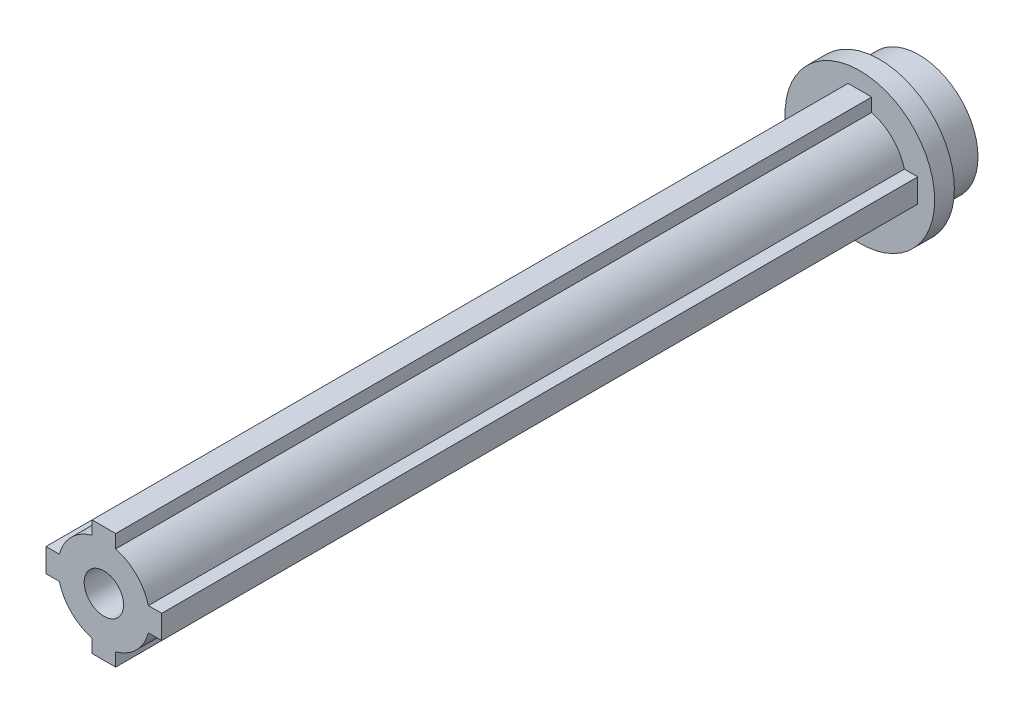
ISO-10303-21;
HEADER;
FILE_DESCRIPTION(('STEP AP214'),'2;1');
FILE_NAME('part.step','',(''),(''),'','','');
FILE_SCHEMA(('AUTOMOTIVE_DESIGN { 1 0 10303 214 1 1 1 1 }'));
ENDSEC;
DATA;
#1=APPLICATION_CONTEXT('core data for automotive mechanical design processes');
#2=APPLICATION_PROTOCOL_DEFINITION('international standard','automotive_design',2000,#1);
#3=PRODUCT_CONTEXT('',#1,'mechanical');
#4=PRODUCT('Part','Part','',(#3));
#5=PRODUCT_RELATED_PRODUCT_CATEGORY('part','',(#4));
#6=PRODUCT_DEFINITION_FORMATION('','',#4);
#7=PRODUCT_DEFINITION_CONTEXT('part definition',#1,'design');
#8=PRODUCT_DEFINITION('design','',#6,#7);
#9=PRODUCT_DEFINITION_SHAPE('','',#8);
#10=(LENGTH_UNIT() NAMED_UNIT(*) SI_UNIT(.MILLI.,.METRE.));
#11=(NAMED_UNIT(*) PLANE_ANGLE_UNIT() SI_UNIT($,.RADIAN.));
#12=(NAMED_UNIT(*) SI_UNIT($,.STERADIAN.) SOLID_ANGLE_UNIT());
#13=UNCERTAINTY_MEASURE_WITH_UNIT(LENGTH_MEASURE(1.E-05),#10,'distance_accuracy_value','');
#14=(GEOMETRIC_REPRESENTATION_CONTEXT(3) GLOBAL_UNCERTAINTY_ASSIGNED_CONTEXT((#13)) GLOBAL_UNIT_ASSIGNED_CONTEXT((#10,
#11,#12)) REPRESENTATION_CONTEXT('',''));
#15=CARTESIAN_POINT('',(0.,0.,0.));
#16=DIRECTION('',(0.,0.,1.));
#17=DIRECTION('',(1.,0.,0.));
#18=AXIS2_PLACEMENT_3D('',#15,#16,#17);
#19=CARTESIAN_POINT('',(0.,0.,5.));
#20=DIRECTION('',(0.,0.,-1.));
#21=DIRECTION('',(-1.,0.,0.));
#22=AXIS2_PLACEMENT_3D('',#19,#20,#21);
#23=CYLINDRICAL_SURFACE('',#22,7.5);
#24=CARTESIAN_POINT('',(0.,0.,5.));
#25=DIRECTION('',(0.,0.,1.));
#26=DIRECTION('',(1.,0.,0.));
#27=AXIS2_PLACEMENT_3D('',#24,#25,#26);
#28=CIRCLE('',#27,7.5);
#29=CARTESIAN_POINT('',(7.5,0.,5.));
#30=VERTEX_POINT('',#29);
#31=EDGE_CURVE('E11',#30,#30,#28,.T.);
#32=ORIENTED_EDGE('',*,*,#31,.F.);
#33=EDGE_LOOP('',(#32));
#34=FACE_BOUND('',#33,.T.);
#35=CARTESIAN_POINT('',(0.,0.,0.));
#36=DIRECTION('',(0.,0.,1.));
#37=DIRECTION('',(1.,0.,0.));
#38=AXIS2_PLACEMENT_3D('',#35,#36,#37);
#39=CIRCLE('',#38,7.5);
#40=CARTESIAN_POINT('',(7.5,0.,0.));
#41=VERTEX_POINT('',#40);
#42=EDGE_CURVE('E42',#41,#41,#39,.T.);
#43=ORIENTED_EDGE('',*,*,#42,.T.);
#44=EDGE_LOOP('',(#43));
#45=FACE_BOUND('',#44,.T.);
#46=ADVANCED_FACE('F39',(#34,#45),#23,.T.);
#47=CARTESIAN_POINT('',(0.,0.,0.));
#48=DIRECTION('',(0.,0.,1.));
#49=DIRECTION('',(1.,0.,0.));
#50=AXIS2_PLACEMENT_3D('',#47,#48,#49);
#51=PLANE('',#50);
#52=ORIENTED_EDGE('',*,*,#42,.F.);
#53=EDGE_LOOP('',(#52));
#54=FACE_BOUND('',#53,.T.);
#55=ADVANCED_FACE('F187',(#54),#51,.F.);
#56=CARTESIAN_POINT('',(0.,0.,7.5));
#57=DIRECTION('',(0.,0.,-1.));
#58=DIRECTION('',(-1.,0.,0.));
#59=AXIS2_PLACEMENT_3D('',#56,#57,#58);
#60=CYLINDRICAL_SURFACE('',#59,9.5);
#61=CARTESIAN_POINT('',(0.,0.,7.5));
#62=DIRECTION('',(0.,0.,1.));
#63=DIRECTION('',(1.,0.,0.));
#64=AXIS2_PLACEMENT_3D('',#61,#62,#63);
#65=CIRCLE('',#64,9.5);
#66=CARTESIAN_POINT('',(9.5,0.,7.5));
#67=VERTEX_POINT('',#66);
#68=EDGE_CURVE('E174',#67,#67,#65,.T.);
#69=ORIENTED_EDGE('',*,*,#68,.F.);
#70=EDGE_LOOP('',(#69));
#71=FACE_BOUND('',#70,.T.);
#72=CARTESIAN_POINT('',(0.,0.,5.));
#73=DIRECTION('',(0.,0.,1.));
#74=DIRECTION('',(1.,0.,0.));
#75=AXIS2_PLACEMENT_3D('',#72,#73,#74);
#76=CIRCLE('',#75,9.5);
#77=CARTESIAN_POINT('',(9.5,0.,5.));
#78=VERTEX_POINT('',#77);
#79=EDGE_CURVE('E171',#78,#78,#76,.T.);
#80=ORIENTED_EDGE('',*,*,#79,.T.);
#81=EDGE_LOOP('',(#80));
#82=FACE_BOUND('',#81,.T.);
#83=ADVANCED_FACE('F189',(#71,#82),#60,.T.);
#84=CARTESIAN_POINT('',(0.,0.,7.5));
#85=DIRECTION('',(0.,0.,1.));
#86=DIRECTION('',(1.,0.,0.));
#87=AXIS2_PLACEMENT_3D('',#84,#85,#86);
#88=PLANE('',#87);
#89=DIRECTION('',(0.,1.,0.));
#90=VECTOR('',#89,1.);
#91=CARTESIAN_POINT('',(1.5,7.34846922834953,7.5));
#92=LINE('',#91,#90);
#93=CARTESIAN_POINT('',(1.5,5.65283931444645,7.5));
#94=VERTEX_POINT('',#93);
#95=CARTESIAN_POINT('',(1.5,7.34846922834953,7.5));
#96=VERTEX_POINT('',#95);
#97=EDGE_CURVE('E53',#94,#96,#92,.T.);
#98=ORIENTED_EDGE('',*,*,#97,.F.);
#99=CARTESIAN_POINT('',(0.,0.,7.5));
#100=DIRECTION('',(0.,0.,1.));
#101=DIRECTION('',(1.,0.,0.));
#102=AXIS2_PLACEMENT_3D('',#99,#100,#101);
#103=CIRCLE('',#102,5.84846922834953);
#104=CARTESIAN_POINT('',(5.65283931444645,1.5,7.5));
#105=VERTEX_POINT('',#104);
#106=EDGE_CURVE('E57',#105,#94,#103,.T.);
#107=ORIENTED_EDGE('',*,*,#106,.F.);
#108=DIRECTION('',(-1.,0.,0.));
#109=VECTOR('',#108,1.);
#110=CARTESIAN_POINT('',(5.65283931444645,1.5,7.5));
#111=LINE('',#110,#109);
#112=CARTESIAN_POINT('',(7.34846922834953,1.5,7.5));
#113=VERTEX_POINT('',#112);
#114=EDGE_CURVE('E351',#113,#105,#111,.T.);
#115=ORIENTED_EDGE('',*,*,#114,.F.);
#116=DIRECTION('',(0.,1.,0.));
#117=VECTOR('',#116,1.);
#118=CARTESIAN_POINT('',(7.34846922834953,1.5,7.5));
#119=LINE('',#118,#117);
#120=CARTESIAN_POINT('',(7.34846922834953,-1.5,7.5));
#121=VERTEX_POINT('',#120);
#122=EDGE_CURVE('E348',#121,#113,#119,.T.);
#123=ORIENTED_EDGE('',*,*,#122,.F.);
#124=DIRECTION('',(1.,0.,0.));
#125=VECTOR('',#124,1.);
#126=CARTESIAN_POINT('',(7.34846922834953,-1.5,7.5));
#127=LINE('',#126,#125);
#128=CARTESIAN_POINT('',(5.65283931444645,-1.5,7.5));
#129=VERTEX_POINT('',#128);
#130=EDGE_CURVE('E345',#129,#121,#127,.T.);
#131=ORIENTED_EDGE('',*,*,#130,.F.);
#132=CARTESIAN_POINT('',(0.,0.,7.5));
#133=DIRECTION('',(0.,0.,1.));
#134=DIRECTION('',(1.,0.,0.));
#135=AXIS2_PLACEMENT_3D('',#132,#133,#134);
#136=CIRCLE('',#135,5.84846922834953);
#137=CARTESIAN_POINT('',(1.5,-5.65283931444645,7.5));
#138=VERTEX_POINT('',#137);
#139=EDGE_CURVE('E342',#138,#129,#136,.T.);
#140=ORIENTED_EDGE('',*,*,#139,.F.);
#141=DIRECTION('',(0.,1.,0.));
#142=VECTOR('',#141,1.);
#143=CARTESIAN_POINT('',(1.5,-5.65283931444645,7.5));
#144=LINE('',#143,#142);
#145=CARTESIAN_POINT('',(1.5,-7.34846922834953,7.5));
#146=VERTEX_POINT('',#145);
#147=EDGE_CURVE('E339',#146,#138,#144,.T.);
#148=ORIENTED_EDGE('',*,*,#147,.F.);
#149=DIRECTION('',(1.,0.,0.));
#150=VECTOR('',#149,1.);
#151=CARTESIAN_POINT('',(1.5,-7.34846922834953,7.5));
#152=LINE('',#151,#150);
#153=CARTESIAN_POINT('',(-1.5,-7.34846922834953,7.5));
#154=VERTEX_POINT('',#153);
#155=EDGE_CURVE('E336',#154,#146,#152,.T.);
#156=ORIENTED_EDGE('',*,*,#155,.F.);
#157=DIRECTION('',(0.,-1.,0.));
#158=VECTOR('',#157,1.);
#159=CARTESIAN_POINT('',(-1.5,-7.34846922834953,7.5));
#160=LINE('',#159,#158);
#161=CARTESIAN_POINT('',(-1.5,-5.65283931444645,7.5));
#162=VERTEX_POINT('',#161);
#163=EDGE_CURVE('E333',#162,#154,#160,.T.);
#164=ORIENTED_EDGE('',*,*,#163,.F.);
#165=CARTESIAN_POINT('',(0.,0.,7.5));
#166=DIRECTION('',(0.,0.,1.));
#167=DIRECTION('',(1.,0.,0.));
#168=AXIS2_PLACEMENT_3D('',#165,#166,#167);
#169=CIRCLE('',#168,5.84846922834953);
#170=CARTESIAN_POINT('',(-5.65283931444645,-1.5,7.5));
#171=VERTEX_POINT('',#170);
#172=EDGE_CURVE('E330',#171,#162,#169,.T.);
#173=ORIENTED_EDGE('',*,*,#172,.F.);
#174=DIRECTION('',(1.,0.,0.));
#175=VECTOR('',#174,1.);
#176=CARTESIAN_POINT('',(-5.65283931444645,-1.5,7.5));
#177=LINE('',#176,#175);
#178=CARTESIAN_POINT('',(-7.34846922834953,-1.5,7.5));
#179=VERTEX_POINT('',#178);
#180=EDGE_CURVE('E327',#179,#171,#177,.T.);
#181=ORIENTED_EDGE('',*,*,#180,.F.);
#182=DIRECTION('',(0.,-1.,0.));
#183=VECTOR('',#182,1.);
#184=CARTESIAN_POINT('',(-7.34846922834953,-1.5,7.5));
#185=LINE('',#184,#183);
#186=CARTESIAN_POINT('',(-7.34846922834953,1.5,7.5));
#187=VERTEX_POINT('',#186);
#188=EDGE_CURVE('E324',#187,#179,#185,.T.);
#189=ORIENTED_EDGE('',*,*,#188,.F.);
#190=DIRECTION('',(-1.,0.,0.));
#191=VECTOR('',#190,1.);
#192=CARTESIAN_POINT('',(-7.34846922834953,1.5,7.5));
#193=LINE('',#192,#191);
#194=CARTESIAN_POINT('',(-5.65283931444645,1.5,7.5));
#195=VERTEX_POINT('',#194);
#196=EDGE_CURVE('E321',#195,#187,#193,.T.);
#197=ORIENTED_EDGE('',*,*,#196,.F.);
#198=CARTESIAN_POINT('',(0.,0.,7.5));
#199=DIRECTION('',(0.,0.,1.));
#200=DIRECTION('',(1.,0.,0.));
#201=AXIS2_PLACEMENT_3D('',#198,#199,#200);
#202=CIRCLE('',#201,5.84846922834953);
#203=CARTESIAN_POINT('',(-1.5,5.65283931444645,7.5));
#204=VERTEX_POINT('',#203);
#205=EDGE_CURVE('E318',#204,#195,#202,.T.);
#206=ORIENTED_EDGE('',*,*,#205,.F.);
#207=DIRECTION('',(0.,-1.,0.));
#208=VECTOR('',#207,1.);
#209=CARTESIAN_POINT('',(-1.5,5.65283931444645,7.5));
#210=LINE('',#209,#208);
#211=CARTESIAN_POINT('',(-1.5,7.34846922834953,7.5));
#212=VERTEX_POINT('',#211);
#213=EDGE_CURVE('E315',#212,#204,#210,.T.);
#214=ORIENTED_EDGE('',*,*,#213,.F.);
#215=DIRECTION('',(-1.,0.,0.));
#216=VECTOR('',#215,1.);
#217=CARTESIAN_POINT('',(-1.5,7.34846922834953,7.5));
#218=LINE('',#217,#216);
#219=EDGE_CURVE('E282',#96,#212,#218,.T.);
#220=ORIENTED_EDGE('',*,*,#219,.F.);
#221=EDGE_LOOP('',(#98,#107,#115,#123,#131,#140,#148,#156,#164,#173,#181,#189,#197,#206,#214,#220));
#222=FACE_BOUND('',#221,.T.);
#223=ORIENTED_EDGE('',*,*,#68,.T.);
#224=EDGE_LOOP('',(#223));
#225=FACE_BOUND('',#224,.T.);
#226=ADVANCED_FACE('F194',(#222,#225),#88,.T.);
#227=CARTESIAN_POINT('',(0.,0.,5.));
#228=DIRECTION('',(0.,0.,1.));
#229=DIRECTION('',(1.,0.,0.));
#230=AXIS2_PLACEMENT_3D('',#227,#228,#229);
#231=PLANE('',#230);
#232=ORIENTED_EDGE('',*,*,#31,.T.);
#233=EDGE_LOOP('',(#232));
#234=FACE_BOUND('',#233,.T.);
#235=ORIENTED_EDGE('',*,*,#79,.F.);
#236=EDGE_LOOP('',(#235));
#237=FACE_BOUND('',#236,.T.);
#238=ADVANCED_FACE('F199',(#234,#237),#231,.F.);
#239=CARTESIAN_POINT('',(1.5,7.34846922834953,103.5));
#240=DIRECTION('',(-1.,0.,0.));
#241=DIRECTION('',(0.,0.,1.));
#242=AXIS2_PLACEMENT_3D('',#239,#240,#241);
#243=PLANE('',#242);
#244=ORIENTED_EDGE('',*,*,#97,.T.);
#245=DIRECTION('',(0.,0.,-1.));
#246=VECTOR('',#245,1.);
#247=CARTESIAN_POINT('',(1.5,7.34846922834953,103.5));
#248=LINE('',#247,#246);
#249=CARTESIAN_POINT('',(1.5,7.34846922834953,103.5));
#250=VERTEX_POINT('',#249);
#251=EDGE_CURVE('E154',#250,#96,#248,.T.);
#252=ORIENTED_EDGE('',*,*,#251,.F.);
#253=DIRECTION('',(0.,1.,0.));
#254=VECTOR('',#253,1.);
#255=CARTESIAN_POINT('',(1.5,7.34846922834953,103.5));
#256=LINE('',#255,#254);
#257=CARTESIAN_POINT('',(1.5,5.65283931444645,103.5));
#258=VERTEX_POINT('',#257);
#259=EDGE_CURVE('E160',#258,#250,#256,.T.);
#260=ORIENTED_EDGE('',*,*,#259,.F.);
#261=DIRECTION('',(0.,0.,-1.));
#262=VECTOR('',#261,1.);
#263=CARTESIAN_POINT('',(1.5,5.65283931444645,103.5));
#264=LINE('',#263,#262);
#265=EDGE_CURVE('E312',#258,#94,#264,.T.);
#266=ORIENTED_EDGE('',*,*,#265,.T.);
#267=EDGE_LOOP('',(#244,#252,#260,#266));
#268=FACE_BOUND('',#267,.T.);
#269=ADVANCED_FACE('F170',(#268),#243,.F.);
#270=CARTESIAN_POINT('',(-1.5,7.34846922834953,103.5));
#271=DIRECTION('',(0.,-1.,0.));
#272=DIRECTION('',(0.,0.,-1.));
#273=AXIS2_PLACEMENT_3D('',#270,#271,#272);
#274=PLANE('',#273);
#275=ORIENTED_EDGE('',*,*,#219,.T.);
#276=DIRECTION('',(0.,0.,-1.));
#277=VECTOR('',#276,1.);
#278=CARTESIAN_POINT('',(-1.5,7.34846922834953,103.5));
#279=LINE('',#278,#277);
#280=CARTESIAN_POINT('',(-1.5,7.34846922834953,103.5));
#281=VERTEX_POINT('',#280);
#282=EDGE_CURVE('E156',#281,#212,#279,.T.);
#283=ORIENTED_EDGE('',*,*,#282,.F.);
#284=DIRECTION('',(-1.,0.,0.));
#285=VECTOR('',#284,1.);
#286=CARTESIAN_POINT('',(-1.5,7.34846922834953,103.5));
#287=LINE('',#286,#285);
#288=EDGE_CURVE('E149',#250,#281,#287,.T.);
#289=ORIENTED_EDGE('',*,*,#288,.F.);
#290=ORIENTED_EDGE('',*,*,#251,.T.);
#291=EDGE_LOOP('',(#275,#283,#289,#290));
#292=FACE_BOUND('',#291,.T.);
#293=ADVANCED_FACE('F152',(#292),#274,.F.);
#294=CARTESIAN_POINT('',(-1.5,5.65283931444645,103.5));
#295=DIRECTION('',(1.,0.,0.));
#296=DIRECTION('',(0.,0.,-1.));
#297=AXIS2_PLACEMENT_3D('',#294,#295,#296);
#298=PLANE('',#297);
#299=ORIENTED_EDGE('',*,*,#213,.T.);
#300=DIRECTION('',(0.,0.,-1.));
#301=VECTOR('',#300,1.);
#302=CARTESIAN_POINT('',(-1.5,5.65283931444645,103.5));
#303=LINE('',#302,#301);
#304=CARTESIAN_POINT('',(-1.5,5.65283931444645,103.5));
#305=VERTEX_POINT('',#304);
#306=EDGE_CURVE('E176',#305,#204,#303,.T.);
#307=ORIENTED_EDGE('',*,*,#306,.F.);
#308=DIRECTION('',(0.,-1.,0.));
#309=VECTOR('',#308,1.);
#310=CARTESIAN_POINT('',(-1.5,5.65283931444645,103.5));
#311=LINE('',#310,#309);
#312=EDGE_CURVE('E159',#281,#305,#311,.T.);
#313=ORIENTED_EDGE('',*,*,#312,.F.);
#314=ORIENTED_EDGE('',*,*,#282,.T.);
#315=EDGE_LOOP('',(#299,#307,#313,#314));
#316=FACE_BOUND('',#315,.T.);
#317=ADVANCED_FACE('F209',(#316),#298,.F.);
#318=CARTESIAN_POINT('',(0.,0.,103.5));
#319=DIRECTION('',(0.,0.,-1.));
#320=DIRECTION('',(-1.,0.,0.));
#321=AXIS2_PLACEMENT_3D('',#318,#319,#320);
#322=CYLINDRICAL_SURFACE('',#321,5.84846922834953);
#323=ORIENTED_EDGE('',*,*,#205,.T.);
#324=DIRECTION('',(0.,0.,-1.));
#325=VECTOR('',#324,1.);
#326=CARTESIAN_POINT('',(-5.65283931444645,1.5,103.5));
#327=LINE('',#326,#325);
#328=CARTESIAN_POINT('',(-5.65283931444645,1.5,103.5));
#329=VERTEX_POINT('',#328);
#330=EDGE_CURVE('E388',#329,#195,#327,.T.);
#331=ORIENTED_EDGE('',*,*,#330,.F.);
#332=CARTESIAN_POINT('',(0.,0.,103.5));
#333=DIRECTION('',(0.,0.,1.));
#334=DIRECTION('',(1.,0.,0.));
#335=AXIS2_PLACEMENT_3D('',#332,#333,#334);
#336=CIRCLE('',#335,5.84846922834953);
#337=EDGE_CURVE('E288',#305,#329,#336,.T.);
#338=ORIENTED_EDGE('',*,*,#337,.F.);
#339=ORIENTED_EDGE('',*,*,#306,.T.);
#340=EDGE_LOOP('',(#323,#331,#338,#339));
#341=FACE_BOUND('',#340,.T.);
#342=ADVANCED_FACE('F212',(#341),#322,.T.);
#343=CARTESIAN_POINT('',(-7.34846922834953,1.5,103.5));
#344=DIRECTION('',(0.,-1.,0.));
#345=DIRECTION('',(0.,0.,-1.));
#346=AXIS2_PLACEMENT_3D('',#343,#344,#345);
#347=PLANE('',#346);
#348=ORIENTED_EDGE('',*,*,#196,.T.);
#349=DIRECTION('',(0.,0.,-1.));
#350=VECTOR('',#349,1.);
#351=CARTESIAN_POINT('',(-7.34846922834953,1.5,103.5));
#352=LINE('',#351,#350);
#353=CARTESIAN_POINT('',(-7.34846922834953,1.5,103.5));
#354=VERTEX_POINT('',#353);
#355=EDGE_CURVE('E385',#354,#187,#352,.T.);
#356=ORIENTED_EDGE('',*,*,#355,.F.);
#357=DIRECTION('',(-1.,0.,0.));
#358=VECTOR('',#357,1.);
#359=CARTESIAN_POINT('',(-7.34846922834953,1.5,103.5));
#360=LINE('',#359,#358);
#361=EDGE_CURVE('E290',#329,#354,#360,.T.);
#362=ORIENTED_EDGE('',*,*,#361,.F.);
#363=ORIENTED_EDGE('',*,*,#330,.T.);
#364=EDGE_LOOP('',(#348,#356,#362,#363));
#365=FACE_BOUND('',#364,.T.);
#366=ADVANCED_FACE('F216',(#365),#347,.F.);
#367=CARTESIAN_POINT('',(-7.34846922834953,-1.5,103.5));
#368=DIRECTION('',(1.,0.,0.));
#369=DIRECTION('',(0.,0.,-1.));
#370=AXIS2_PLACEMENT_3D('',#367,#368,#369);
#371=PLANE('',#370);
#372=ORIENTED_EDGE('',*,*,#188,.T.);
#373=DIRECTION('',(0.,0.,-1.));
#374=VECTOR('',#373,1.);
#375=CARTESIAN_POINT('',(-7.34846922834953,-1.5,103.5));
#376=LINE('',#375,#374);
#377=CARTESIAN_POINT('',(-7.34846922834953,-1.5,103.5));
#378=VERTEX_POINT('',#377);
#379=EDGE_CURVE('E382',#378,#179,#376,.T.);
#380=ORIENTED_EDGE('',*,*,#379,.F.);
#381=DIRECTION('',(0.,-1.,0.));
#382=VECTOR('',#381,1.);
#383=CARTESIAN_POINT('',(-7.34846922834953,-1.5,103.5));
#384=LINE('',#383,#382);
#385=EDGE_CURVE('E292',#354,#378,#384,.T.);
#386=ORIENTED_EDGE('',*,*,#385,.F.);
#387=ORIENTED_EDGE('',*,*,#355,.T.);
#388=EDGE_LOOP('',(#372,#380,#386,#387));
#389=FACE_BOUND('',#388,.T.);
#390=ADVANCED_FACE('F220',(#389),#371,.F.);
#391=CARTESIAN_POINT('',(-5.65283931444645,-1.5,103.5));
#392=DIRECTION('',(0.,1.,0.));
#393=DIRECTION('',(0.,0.,1.));
#394=AXIS2_PLACEMENT_3D('',#391,#392,#393);
#395=PLANE('',#394);
#396=ORIENTED_EDGE('',*,*,#180,.T.);
#397=DIRECTION('',(0.,0.,-1.));
#398=VECTOR('',#397,1.);
#399=CARTESIAN_POINT('',(-5.65283931444645,-1.5,103.5));
#400=LINE('',#399,#398);
#401=CARTESIAN_POINT('',(-5.65283931444645,-1.5,103.5));
#402=VERTEX_POINT('',#401);
#403=EDGE_CURVE('E379',#402,#171,#400,.T.);
#404=ORIENTED_EDGE('',*,*,#403,.F.);
#405=DIRECTION('',(1.,0.,0.));
#406=VECTOR('',#405,1.);
#407=CARTESIAN_POINT('',(-5.65283931444645,-1.5,103.5));
#408=LINE('',#407,#406);
#409=EDGE_CURVE('E294',#378,#402,#408,.T.);
#410=ORIENTED_EDGE('',*,*,#409,.F.);
#411=ORIENTED_EDGE('',*,*,#379,.T.);
#412=EDGE_LOOP('',(#396,#404,#410,#411));
#413=FACE_BOUND('',#412,.T.);
#414=ADVANCED_FACE('F224',(#413),#395,.F.);
#415=CARTESIAN_POINT('',(0.,0.,103.5));
#416=DIRECTION('',(0.,0.,-1.));
#417=DIRECTION('',(-1.,0.,0.));
#418=AXIS2_PLACEMENT_3D('',#415,#416,#417);
#419=CYLINDRICAL_SURFACE('',#418,5.84846922834953);
#420=ORIENTED_EDGE('',*,*,#172,.T.);
#421=DIRECTION('',(0.,0.,-1.));
#422=VECTOR('',#421,1.);
#423=CARTESIAN_POINT('',(-1.5,-5.65283931444645,103.5));
#424=LINE('',#423,#422);
#425=CARTESIAN_POINT('',(-1.5,-5.65283931444645,103.5));
#426=VERTEX_POINT('',#425);
#427=EDGE_CURVE('E376',#426,#162,#424,.T.);
#428=ORIENTED_EDGE('',*,*,#427,.F.);
#429=CARTESIAN_POINT('',(0.,0.,103.5));
#430=DIRECTION('',(0.,0.,1.));
#431=DIRECTION('',(1.,0.,0.));
#432=AXIS2_PLACEMENT_3D('',#429,#430,#431);
#433=CIRCLE('',#432,5.84846922834953);
#434=EDGE_CURVE('E296',#402,#426,#433,.T.);
#435=ORIENTED_EDGE('',*,*,#434,.F.);
#436=ORIENTED_EDGE('',*,*,#403,.T.);
#437=EDGE_LOOP('',(#420,#428,#435,#436));
#438=FACE_BOUND('',#437,.T.);
#439=ADVANCED_FACE('F228',(#438),#419,.T.);
#440=CARTESIAN_POINT('',(-1.5,-7.34846922834953,103.5));
#441=DIRECTION('',(1.,0.,0.));
#442=DIRECTION('',(0.,0.,-1.));
#443=AXIS2_PLACEMENT_3D('',#440,#441,#442);
#444=PLANE('',#443);
#445=ORIENTED_EDGE('',*,*,#163,.T.);
#446=DIRECTION('',(0.,0.,-1.));
#447=VECTOR('',#446,1.);
#448=CARTESIAN_POINT('',(-1.5,-7.34846922834953,103.5));
#449=LINE('',#448,#447);
#450=CARTESIAN_POINT('',(-1.5,-7.34846922834953,103.5));
#451=VERTEX_POINT('',#450);
#452=EDGE_CURVE('E373',#451,#154,#449,.T.);
#453=ORIENTED_EDGE('',*,*,#452,.F.);
#454=DIRECTION('',(0.,-1.,0.));
#455=VECTOR('',#454,1.);
#456=CARTESIAN_POINT('',(-1.5,-7.34846922834953,103.5));
#457=LINE('',#456,#455);
#458=EDGE_CURVE('E298',#426,#451,#457,.T.);
#459=ORIENTED_EDGE('',*,*,#458,.F.);
#460=ORIENTED_EDGE('',*,*,#427,.T.);
#461=EDGE_LOOP('',(#445,#453,#459,#460));
#462=FACE_BOUND('',#461,.T.);
#463=ADVANCED_FACE('F232',(#462),#444,.F.);
#464=CARTESIAN_POINT('',(1.5,-7.34846922834953,103.5));
#465=DIRECTION('',(0.,1.,0.));
#466=DIRECTION('',(0.,0.,1.));
#467=AXIS2_PLACEMENT_3D('',#464,#465,#466);
#468=PLANE('',#467);
#469=ORIENTED_EDGE('',*,*,#155,.T.);
#470=DIRECTION('',(0.,0.,-1.));
#471=VECTOR('',#470,1.);
#472=CARTESIAN_POINT('',(1.5,-7.34846922834953,103.5));
#473=LINE('',#472,#471);
#474=CARTESIAN_POINT('',(1.5,-7.34846922834953,103.5));
#475=VERTEX_POINT('',#474);
#476=EDGE_CURVE('E370',#475,#146,#473,.T.);
#477=ORIENTED_EDGE('',*,*,#476,.F.);
#478=DIRECTION('',(1.,0.,0.));
#479=VECTOR('',#478,1.);
#480=CARTESIAN_POINT('',(1.5,-7.34846922834953,103.5));
#481=LINE('',#480,#479);
#482=EDGE_CURVE('E300',#451,#475,#481,.T.);
#483=ORIENTED_EDGE('',*,*,#482,.F.);
#484=ORIENTED_EDGE('',*,*,#452,.T.);
#485=EDGE_LOOP('',(#469,#477,#483,#484));
#486=FACE_BOUND('',#485,.T.);
#487=ADVANCED_FACE('F236',(#486),#468,.F.);
#488=CARTESIAN_POINT('',(1.5,-5.65283931444645,103.5));
#489=DIRECTION('',(-1.,0.,0.));
#490=DIRECTION('',(0.,0.,1.));
#491=AXIS2_PLACEMENT_3D('',#488,#489,#490);
#492=PLANE('',#491);
#493=ORIENTED_EDGE('',*,*,#147,.T.);
#494=DIRECTION('',(0.,0.,-1.));
#495=VECTOR('',#494,1.);
#496=CARTESIAN_POINT('',(1.5,-5.65283931444645,103.5));
#497=LINE('',#496,#495);
#498=CARTESIAN_POINT('',(1.5,-5.65283931444645,103.5));
#499=VERTEX_POINT('',#498);
#500=EDGE_CURVE('E367',#499,#138,#497,.T.);
#501=ORIENTED_EDGE('',*,*,#500,.F.);
#502=DIRECTION('',(0.,1.,0.));
#503=VECTOR('',#502,1.);
#504=CARTESIAN_POINT('',(1.5,-5.65283931444645,103.5));
#505=LINE('',#504,#503);
#506=EDGE_CURVE('E302',#475,#499,#505,.T.);
#507=ORIENTED_EDGE('',*,*,#506,.F.);
#508=ORIENTED_EDGE('',*,*,#476,.T.);
#509=EDGE_LOOP('',(#493,#501,#507,#508));
#510=FACE_BOUND('',#509,.T.);
#511=ADVANCED_FACE('F240',(#510),#492,.F.);
#512=CARTESIAN_POINT('',(0.,0.,103.5));
#513=DIRECTION('',(0.,0.,-1.));
#514=DIRECTION('',(-1.,0.,0.));
#515=AXIS2_PLACEMENT_3D('',#512,#513,#514);
#516=CYLINDRICAL_SURFACE('',#515,5.84846922834953);
#517=ORIENTED_EDGE('',*,*,#139,.T.);
#518=DIRECTION('',(0.,0.,-1.));
#519=VECTOR('',#518,1.);
#520=CARTESIAN_POINT('',(5.65283931444645,-1.5,103.5));
#521=LINE('',#520,#519);
#522=CARTESIAN_POINT('',(5.65283931444645,-1.5,103.5));
#523=VERTEX_POINT('',#522);
#524=EDGE_CURVE('E364',#523,#129,#521,.T.);
#525=ORIENTED_EDGE('',*,*,#524,.F.);
#526=CARTESIAN_POINT('',(0.,0.,103.5));
#527=DIRECTION('',(0.,0.,1.));
#528=DIRECTION('',(1.,0.,0.));
#529=AXIS2_PLACEMENT_3D('',#526,#527,#528);
#530=CIRCLE('',#529,5.84846922834953);
#531=EDGE_CURVE('E304',#499,#523,#530,.T.);
#532=ORIENTED_EDGE('',*,*,#531,.F.);
#533=ORIENTED_EDGE('',*,*,#500,.T.);
#534=EDGE_LOOP('',(#517,#525,#532,#533));
#535=FACE_BOUND('',#534,.T.);
#536=ADVANCED_FACE('F244',(#535),#516,.T.);
#537=CARTESIAN_POINT('',(7.34846922834953,-1.5,103.5));
#538=DIRECTION('',(0.,1.,0.));
#539=DIRECTION('',(0.,0.,1.));
#540=AXIS2_PLACEMENT_3D('',#537,#538,#539);
#541=PLANE('',#540);
#542=ORIENTED_EDGE('',*,*,#130,.T.);
#543=DIRECTION('',(0.,0.,-1.));
#544=VECTOR('',#543,1.);
#545=CARTESIAN_POINT('',(7.34846922834953,-1.5,103.5));
#546=LINE('',#545,#544);
#547=CARTESIAN_POINT('',(7.34846922834953,-1.5,103.5));
#548=VERTEX_POINT('',#547);
#549=EDGE_CURVE('E361',#548,#121,#546,.T.);
#550=ORIENTED_EDGE('',*,*,#549,.F.);
#551=DIRECTION('',(1.,0.,0.));
#552=VECTOR('',#551,1.);
#553=CARTESIAN_POINT('',(7.34846922834953,-1.5,103.5));
#554=LINE('',#553,#552);
#555=EDGE_CURVE('E306',#523,#548,#554,.T.);
#556=ORIENTED_EDGE('',*,*,#555,.F.);
#557=ORIENTED_EDGE('',*,*,#524,.T.);
#558=EDGE_LOOP('',(#542,#550,#556,#557));
#559=FACE_BOUND('',#558,.T.);
#560=ADVANCED_FACE('F248',(#559),#541,.F.);
#561=CARTESIAN_POINT('',(7.34846922834953,1.5,103.5));
#562=DIRECTION('',(-1.,0.,0.));
#563=DIRECTION('',(0.,0.,1.));
#564=AXIS2_PLACEMENT_3D('',#561,#562,#563);
#565=PLANE('',#564);
#566=ORIENTED_EDGE('',*,*,#122,.T.);
#567=DIRECTION('',(0.,0.,-1.));
#568=VECTOR('',#567,1.);
#569=CARTESIAN_POINT('',(7.34846922834953,1.5,103.5));
#570=LINE('',#569,#568);
#571=CARTESIAN_POINT('',(7.34846922834953,1.5,103.5));
#572=VERTEX_POINT('',#571);
#573=EDGE_CURVE('E358',#572,#113,#570,.T.);
#574=ORIENTED_EDGE('',*,*,#573,.F.);
#575=DIRECTION('',(0.,1.,0.));
#576=VECTOR('',#575,1.);
#577=CARTESIAN_POINT('',(7.34846922834953,1.5,103.5));
#578=LINE('',#577,#576);
#579=EDGE_CURVE('E308',#548,#572,#578,.T.);
#580=ORIENTED_EDGE('',*,*,#579,.F.);
#581=ORIENTED_EDGE('',*,*,#549,.T.);
#582=EDGE_LOOP('',(#566,#574,#580,#581));
#583=FACE_BOUND('',#582,.T.);
#584=ADVANCED_FACE('F252',(#583),#565,.F.);
#585=CARTESIAN_POINT('',(5.65283931444645,1.5,103.5));
#586=DIRECTION('',(0.,-1.,0.));
#587=DIRECTION('',(0.,0.,-1.));
#588=AXIS2_PLACEMENT_3D('',#585,#586,#587);
#589=PLANE('',#588);
#590=ORIENTED_EDGE('',*,*,#114,.T.);
#591=DIRECTION('',(0.,0.,-1.));
#592=VECTOR('',#591,1.);
#593=CARTESIAN_POINT('',(5.65283931444645,1.5,103.5));
#594=LINE('',#593,#592);
#595=CARTESIAN_POINT('',(5.65283931444645,1.5,103.5));
#596=VERTEX_POINT('',#595);
#597=EDGE_CURVE('E355',#596,#105,#594,.T.);
#598=ORIENTED_EDGE('',*,*,#597,.F.);
#599=DIRECTION('',(-1.,0.,0.));
#600=VECTOR('',#599,1.);
#601=CARTESIAN_POINT('',(5.65283931444645,1.5,103.5));
#602=LINE('',#601,#600);
#603=EDGE_CURVE('E310',#572,#596,#602,.T.);
#604=ORIENTED_EDGE('',*,*,#603,.F.);
#605=ORIENTED_EDGE('',*,*,#573,.T.);
#606=EDGE_LOOP('',(#590,#598,#604,#605));
#607=FACE_BOUND('',#606,.T.);
#608=ADVANCED_FACE('F256',(#607),#589,.F.);
#609=CARTESIAN_POINT('',(0.,0.,103.5));
#610=DIRECTION('',(0.,0.,-1.));
#611=DIRECTION('',(-1.,0.,0.));
#612=AXIS2_PLACEMENT_3D('',#609,#610,#611);
#613=CYLINDRICAL_SURFACE('',#612,5.84846922834953);
#614=ORIENTED_EDGE('',*,*,#106,.T.);
#615=ORIENTED_EDGE('',*,*,#265,.F.);
#616=CARTESIAN_POINT('',(0.,0.,103.5));
#617=DIRECTION('',(0.,0.,1.));
#618=DIRECTION('',(1.,0.,0.));
#619=AXIS2_PLACEMENT_3D('',#616,#617,#618);
#620=CIRCLE('',#619,5.84846922834953);
#621=EDGE_CURVE('E165',#596,#258,#620,.T.);
#622=ORIENTED_EDGE('',*,*,#621,.F.);
#623=ORIENTED_EDGE('',*,*,#597,.T.);
#624=EDGE_LOOP('',(#614,#615,#622,#623));
#625=FACE_BOUND('',#624,.T.);
#626=ADVANCED_FACE('F260',(#625),#613,.T.);
#627=CARTESIAN_POINT('',(0.,0.,103.5));
#628=DIRECTION('',(0.,0.,1.));
#629=DIRECTION('',(1.,0.,0.));
#630=AXIS2_PLACEMENT_3D('',#627,#628,#629);
#631=PLANE('',#630);
#632=CARTESIAN_POINT('',(0.,0.,103.5));
#633=DIRECTION('',(0.,0.,1.));
#634=DIRECTION('',(1.,0.,0.));
#635=AXIS2_PLACEMENT_3D('',#632,#633,#634);
#636=CIRCLE('',#635,2.5);
#637=CARTESIAN_POINT('',(2.5,0.,103.5));
#638=VERTEX_POINT('',#637);
#639=EDGE_CURVE('E280',#638,#638,#636,.T.);
#640=ORIENTED_EDGE('',*,*,#639,.F.);
#641=EDGE_LOOP('',(#640));
#642=FACE_BOUND('',#641,.T.);
#643=ORIENTED_EDGE('',*,*,#259,.T.);
#644=ORIENTED_EDGE('',*,*,#288,.T.);
#645=ORIENTED_EDGE('',*,*,#312,.T.);
#646=ORIENTED_EDGE('',*,*,#337,.T.);
#647=ORIENTED_EDGE('',*,*,#361,.T.);
#648=ORIENTED_EDGE('',*,*,#385,.T.);
#649=ORIENTED_EDGE('',*,*,#409,.T.);
#650=ORIENTED_EDGE('',*,*,#434,.T.);
#651=ORIENTED_EDGE('',*,*,#458,.T.);
#652=ORIENTED_EDGE('',*,*,#482,.T.);
#653=ORIENTED_EDGE('',*,*,#506,.T.);
#654=ORIENTED_EDGE('',*,*,#531,.T.);
#655=ORIENTED_EDGE('',*,*,#555,.T.);
#656=ORIENTED_EDGE('',*,*,#579,.T.);
#657=ORIENTED_EDGE('',*,*,#603,.T.);
#658=ORIENTED_EDGE('',*,*,#621,.T.);
#659=EDGE_LOOP('',(#643,#644,#645,#646,#647,#648,#649,#650,#651,#652,#653,#654,#655,#656,#657,#658));
#660=FACE_BOUND('',#659,.T.);
#661=ADVANCED_FACE('F163',(#642,#660),#631,.T.);
#662=CARTESIAN_POINT('',(0.,0.,98.5));
#663=DIRECTION('',(0.,0.,1.));
#664=DIRECTION('',(1.,0.,0.));
#665=AXIS2_PLACEMENT_3D('',#662,#663,#664);
#666=CYLINDRICAL_SURFACE('',#665,2.5);
#667=CARTESIAN_POINT('',(0.,0.,98.5));
#668=DIRECTION('',(0.,0.,1.));
#669=DIRECTION('',(1.,0.,0.));
#670=AXIS2_PLACEMENT_3D('',#667,#668,#669);
#671=CIRCLE('',#670,2.5);
#672=CARTESIAN_POINT('',(2.5,0.,98.5));
#673=VERTEX_POINT('',#672);
#674=EDGE_CURVE('E279',#673,#673,#671,.T.);
#675=ORIENTED_EDGE('',*,*,#674,.F.);
#676=EDGE_LOOP('',(#675));
#677=FACE_BOUND('',#676,.T.);
#678=ORIENTED_EDGE('',*,*,#639,.T.);
#679=EDGE_LOOP('',(#678));
#680=FACE_BOUND('',#679,.T.);
#681=ADVANCED_FACE('F267',(#677,#680),#666,.F.);
#682=CARTESIAN_POINT('',(0.,0.,98.5));
#683=DIRECTION('',(0.,0.,1.));
#684=DIRECTION('',(1.,0.,0.));
#685=AXIS2_PLACEMENT_3D('',#682,#683,#684);
#686=PLANE('',#685);
#687=ORIENTED_EDGE('',*,*,#674,.T.);
#688=EDGE_LOOP('',(#687));
#689=FACE_BOUND('',#688,.T.);
#690=ADVANCED_FACE('F271',(#689),#686,.T.);
#691=CLOSED_SHELL('',(#46,#55,#83,#226,#238,#269,#293,#317,#342,#366,#390,#414,#439,#463,#487,
#511,#536,#560,#584,#608,#626,#661,#681,#690));
#692=MANIFOLD_SOLID_BREP('B2',#691);
#693=ADVANCED_BREP_SHAPE_REPRESENTATION('',(#18,#692),#14);
#694=SHAPE_DEFINITION_REPRESENTATION(#9,#693);
ENDSEC;
END-ISO-10303-21;
